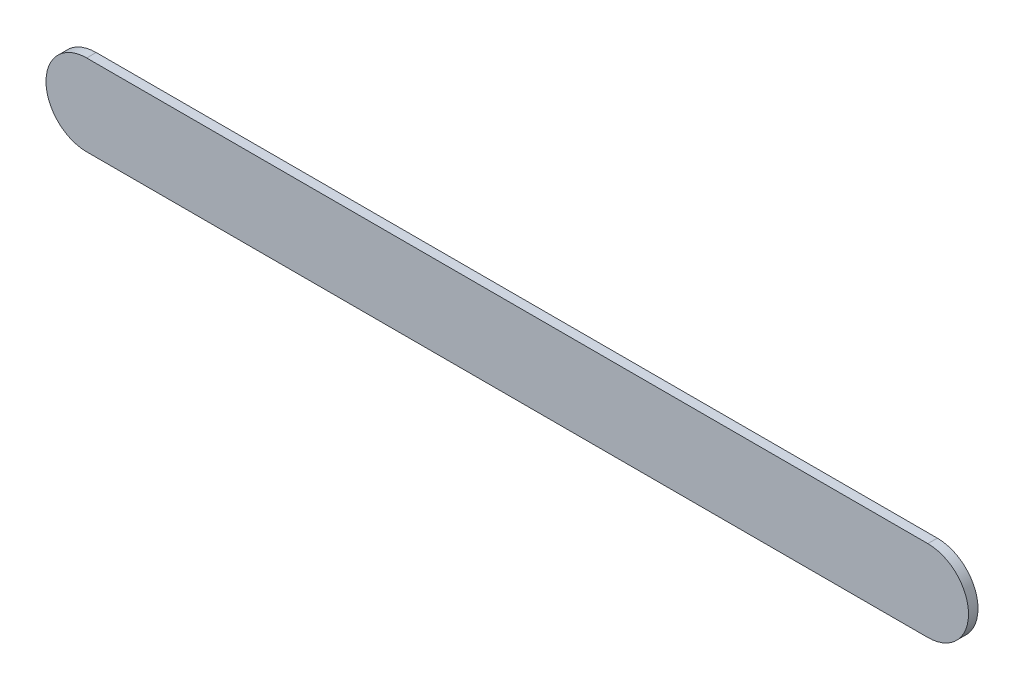
ISO-10303-21;
HEADER;
FILE_DESCRIPTION(('STEP AP214'),'2;1');
FILE_NAME('part.step','',(''),(''),'','','');
FILE_SCHEMA(('AUTOMOTIVE_DESIGN { 1 0 10303 214 1 1 1 1 }'));
ENDSEC;
DATA;
#1=APPLICATION_CONTEXT('core data for automotive mechanical design processes');
#2=APPLICATION_PROTOCOL_DEFINITION('international standard','automotive_design',2000,#1);
#3=PRODUCT_CONTEXT('',#1,'mechanical');
#4=PRODUCT('Part','Part','',(#3));
#5=PRODUCT_RELATED_PRODUCT_CATEGORY('part','',(#4));
#6=PRODUCT_DEFINITION_FORMATION('','',#4);
#7=PRODUCT_DEFINITION_CONTEXT('part definition',#1,'design');
#8=PRODUCT_DEFINITION('design','',#6,#7);
#9=PRODUCT_DEFINITION_SHAPE('','',#8);
#10=(LENGTH_UNIT() NAMED_UNIT(*) SI_UNIT(.MILLI.,.METRE.));
#11=(NAMED_UNIT(*) PLANE_ANGLE_UNIT() SI_UNIT($,.RADIAN.));
#12=(NAMED_UNIT(*) SI_UNIT($,.STERADIAN.) SOLID_ANGLE_UNIT());
#13=UNCERTAINTY_MEASURE_WITH_UNIT(LENGTH_MEASURE(1.E-05),#10,'distance_accuracy_value','');
#14=(GEOMETRIC_REPRESENTATION_CONTEXT(3) GLOBAL_UNCERTAINTY_ASSIGNED_CONTEXT((#13)) GLOBAL_UNIT_ASSIGNED_CONTEXT((#10,
#11,#12)) REPRESENTATION_CONTEXT('',''));
#15=CARTESIAN_POINT('',(0.,0.,0.));
#16=DIRECTION('',(0.,0.,1.));
#17=DIRECTION('',(1.,0.,0.));
#18=AXIS2_PLACEMENT_3D('',#15,#16,#17);
#19=CARTESIAN_POINT('',(127.72688,-59.67,1.635));
#20=DIRECTION('',(0.,0.,1.));
#21=DIRECTION('',(1.,0.,0.));
#22=AXIS2_PLACEMENT_3D('',#19,#20,#21);
#23=PLANE('',#22);
#24=DIRECTION('',(1.,0.,0.));
#25=VECTOR('',#24,1.);
#26=CARTESIAN_POINT('',(127.72688,-59.67,1.635));
#27=LINE('',#26,#25);
#28=CARTESIAN_POINT('',(127.72688,-59.67,1.635));
#29=VERTEX_POINT('',#28);
#30=CARTESIAN_POINT('',(130.83,-59.67,1.635));
#31=VERTEX_POINT('',#30);
#32=EDGE_CURVE('E74',#29,#31,#27,.T.);
#33=ORIENTED_EDGE('',*,*,#32,.T.);
#34=CARTESIAN_POINT('',(130.83,-59.52,1.635));
#35=DIRECTION('',(0.,0.,1.));
#36=DIRECTION('',(1.894780628694E-13,-1.,0.));
#37=AXIS2_PLACEMENT_3D('',#34,#35,#36);
#38=CIRCLE('',#37,0.15);
#39=CARTESIAN_POINT('',(130.83,-59.37,1.635));
#40=VERTEX_POINT('',#39);
#41=EDGE_CURVE('E72',#31,#40,#38,.T.);
#42=ORIENTED_EDGE('',*,*,#41,.T.);
#43=DIRECTION('',(-1.,0.,0.));
#44=VECTOR('',#43,1.);
#45=CARTESIAN_POINT('',(130.83,-59.37,1.635));
#46=LINE('',#45,#44);
#47=CARTESIAN_POINT('',(127.72688,-59.37,1.635));
#48=VERTEX_POINT('',#47);
#49=EDGE_CURVE('E60',#40,#48,#46,.T.);
#50=ORIENTED_EDGE('',*,*,#49,.T.);
#51=CARTESIAN_POINT('',(127.72688,-59.52,1.635));
#52=DIRECTION('',(0.,0.,1.));
#53=DIRECTION('',(0.,1.,0.));
#54=AXIS2_PLACEMENT_3D('',#51,#52,#53);
#55=CIRCLE('',#54,0.15);
#56=EDGE_CURVE('E11',#48,#29,#55,.T.);
#57=ORIENTED_EDGE('',*,*,#56,.T.);
#58=EDGE_LOOP('',(#33,#42,#50,#57));
#59=FACE_BOUND('',#58,.T.);
#60=ADVANCED_FACE('F17',(#59),#23,.T.);
#61=CARTESIAN_POINT('',(127.72688,-59.67,1.6));
#62=DIRECTION('',(0.,0.,1.));
#63=DIRECTION('',(1.,0.,0.));
#64=AXIS2_PLACEMENT_3D('',#61,#62,#63);
#65=PLANE('',#64);
#66=CARTESIAN_POINT('',(127.72688,-59.52,1.6));
#67=DIRECTION('',(0.,0.,1.));
#68=DIRECTION('',(0.,1.,0.));
#69=AXIS2_PLACEMENT_3D('',#66,#67,#68);
#70=CIRCLE('',#69,0.15);
#71=CARTESIAN_POINT('',(127.72688,-59.37,1.6));
#72=VERTEX_POINT('',#71);
#73=CARTESIAN_POINT('',(127.72688,-59.67,1.6));
#74=VERTEX_POINT('',#73);
#75=EDGE_CURVE('E26',#72,#74,#70,.T.);
#76=ORIENTED_EDGE('',*,*,#75,.F.);
#77=DIRECTION('',(-1.,0.,0.));
#78=VECTOR('',#77,1.);
#79=CARTESIAN_POINT('',(130.83,-59.37,1.6));
#80=LINE('',#79,#78);
#81=CARTESIAN_POINT('',(130.83,-59.37,1.6));
#82=VERTEX_POINT('',#81);
#83=EDGE_CURVE('E79',#82,#72,#80,.T.);
#84=ORIENTED_EDGE('',*,*,#83,.F.);
#85=CARTESIAN_POINT('',(130.83,-59.52,1.6));
#86=DIRECTION('',(0.,0.,1.));
#87=DIRECTION('',(1.894780628694E-13,-1.,0.));
#88=AXIS2_PLACEMENT_3D('',#85,#86,#87);
#89=CIRCLE('',#88,0.15);
#90=CARTESIAN_POINT('',(130.83,-59.67,1.6));
#91=VERTEX_POINT('',#90);
#92=EDGE_CURVE('E83',#91,#82,#89,.T.);
#93=ORIENTED_EDGE('',*,*,#92,.F.);
#94=DIRECTION('',(1.,0.,0.));
#95=VECTOR('',#94,1.);
#96=CARTESIAN_POINT('',(127.72688,-59.67,1.6));
#97=LINE('',#96,#95);
#98=EDGE_CURVE('E133',#74,#91,#97,.T.);
#99=ORIENTED_EDGE('',*,*,#98,.F.);
#100=EDGE_LOOP('',(#76,#84,#93,#99));
#101=FACE_BOUND('',#100,.T.);
#102=ADVANCED_FACE('F155',(#101),#65,.F.);
#103=CARTESIAN_POINT('',(127.72688,-59.52,1.6));
#104=DIRECTION('',(0.,0.,-1.));
#105=DIRECTION('',(0.,1.,0.));
#106=AXIS2_PLACEMENT_3D('',#103,#104,#105);
#107=CYLINDRICAL_SURFACE('',#106,0.15);
#108=ORIENTED_EDGE('',*,*,#75,.T.);
#109=DIRECTION('',(0.,0.,1.));
#110=VECTOR('',#109,1.);
#111=CARTESIAN_POINT('',(127.72688,-59.67,1.6));
#112=LINE('',#111,#110);
#113=EDGE_CURVE('E90',#74,#29,#112,.T.);
#114=ORIENTED_EDGE('',*,*,#113,.T.);
#115=ORIENTED_EDGE('',*,*,#56,.F.);
#116=DIRECTION('',(0.,0.,1.));
#117=VECTOR('',#116,1.);
#118=CARTESIAN_POINT('',(127.72688,-59.37,1.6));
#119=LINE('',#118,#117);
#120=EDGE_CURVE('E67',#72,#48,#119,.T.);
#121=ORIENTED_EDGE('',*,*,#120,.F.);
#122=EDGE_LOOP('',(#108,#114,#115,#121));
#123=FACE_BOUND('',#122,.T.);
#124=ADVANCED_FACE('F154',(#123),#107,.T.);
#125=CARTESIAN_POINT('',(130.83,-59.37,1.6));
#126=DIRECTION('',(0.,-1.,0.));
#127=DIRECTION('',(0.,0.,-1.));
#128=AXIS2_PLACEMENT_3D('',#125,#126,#127);
#129=PLANE('',#128);
#130=ORIENTED_EDGE('',*,*,#83,.T.);
#131=ORIENTED_EDGE('',*,*,#120,.T.);
#132=ORIENTED_EDGE('',*,*,#49,.F.);
#133=DIRECTION('',(0.,0.,1.));
#134=VECTOR('',#133,1.);
#135=CARTESIAN_POINT('',(130.83,-59.37,1.6));
#136=LINE('',#135,#134);
#137=EDGE_CURVE('E65',#82,#40,#136,.T.);
#138=ORIENTED_EDGE('',*,*,#137,.F.);
#139=EDGE_LOOP('',(#130,#131,#132,#138));
#140=FACE_BOUND('',#139,.T.);
#141=ADVANCED_FACE('F63',(#140),#129,.F.);
#142=CARTESIAN_POINT('',(130.83,-59.52,1.6));
#143=DIRECTION('',(0.,0.,-1.));
#144=DIRECTION('',(1.894780628694E-13,-1.,0.));
#145=AXIS2_PLACEMENT_3D('',#142,#143,#144);
#146=CYLINDRICAL_SURFACE('',#145,0.15);
#147=ORIENTED_EDGE('',*,*,#92,.T.);
#148=ORIENTED_EDGE('',*,*,#137,.T.);
#149=ORIENTED_EDGE('',*,*,#41,.F.);
#150=DIRECTION('',(0.,0.,1.));
#151=VECTOR('',#150,1.);
#152=CARTESIAN_POINT('',(130.83,-59.67,1.6));
#153=LINE('',#152,#151);
#154=EDGE_CURVE('E124',#91,#31,#153,.T.);
#155=ORIENTED_EDGE('',*,*,#154,.F.);
#156=EDGE_LOOP('',(#147,#148,#149,#155));
#157=FACE_BOUND('',#156,.T.);
#158=ADVANCED_FACE('F81',(#157),#146,.T.);
#159=CARTESIAN_POINT('',(127.72688,-59.67,1.6));
#160=DIRECTION('',(0.,1.,0.));
#161=DIRECTION('',(1.,0.,0.));
#162=AXIS2_PLACEMENT_3D('',#159,#160,#161);
#163=PLANE('',#162);
#164=ORIENTED_EDGE('',*,*,#98,.T.);
#165=ORIENTED_EDGE('',*,*,#154,.T.);
#166=ORIENTED_EDGE('',*,*,#32,.F.);
#167=ORIENTED_EDGE('',*,*,#113,.F.);
#168=EDGE_LOOP('',(#164,#165,#166,#167));
#169=FACE_BOUND('',#168,.T.);
#170=ADVANCED_FACE('F145',(#169),#163,.F.);
#171=CLOSED_SHELL('',(#60,#102,#124,#141,#158,#170));
#172=MANIFOLD_SOLID_BREP('B1',#171);
#173=ADVANCED_BREP_SHAPE_REPRESENTATION('',(#18,#172),#14);
#174=SHAPE_DEFINITION_REPRESENTATION(#9,#173);
ENDSEC;
END-ISO-10303-21;
